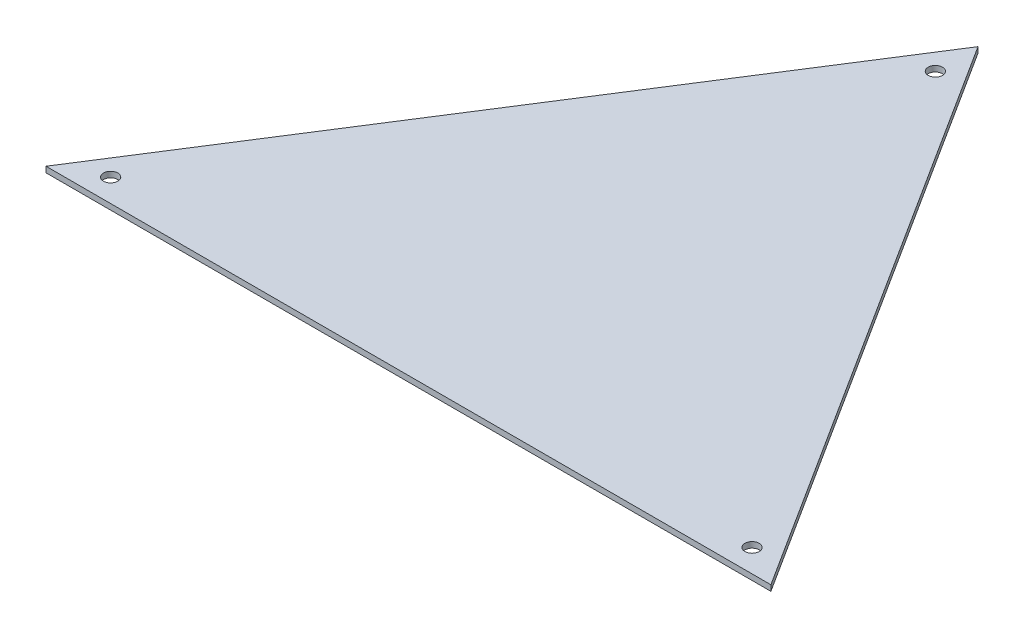
ISO-10303-21;
HEADER;
FILE_DESCRIPTION(('STEP AP214'),'2;1');
FILE_NAME('part.step','',(''),(''),'','','');
FILE_SCHEMA(('AUTOMOTIVE_DESIGN { 1 0 10303 214 1 1 1 1 }'));
ENDSEC;
DATA;
#1=APPLICATION_CONTEXT('core data for automotive mechanical design processes');
#2=APPLICATION_PROTOCOL_DEFINITION('international standard','automotive_design',2000,#1);
#3=PRODUCT_CONTEXT('',#1,'mechanical');
#4=PRODUCT('Part','Part','',(#3));
#5=PRODUCT_RELATED_PRODUCT_CATEGORY('part','',(#4));
#6=PRODUCT_DEFINITION_FORMATION('','',#4);
#7=PRODUCT_DEFINITION_CONTEXT('part definition',#1,'design');
#8=PRODUCT_DEFINITION('design','',#6,#7);
#9=PRODUCT_DEFINITION_SHAPE('','',#8);
#10=(LENGTH_UNIT() NAMED_UNIT(*) SI_UNIT(.MILLI.,.METRE.));
#11=(NAMED_UNIT(*) PLANE_ANGLE_UNIT() SI_UNIT($,.RADIAN.));
#12=(NAMED_UNIT(*) SI_UNIT($,.STERADIAN.) SOLID_ANGLE_UNIT());
#13=UNCERTAINTY_MEASURE_WITH_UNIT(LENGTH_MEASURE(1.E-05),#10,'distance_accuracy_value','');
#14=(GEOMETRIC_REPRESENTATION_CONTEXT(3) GLOBAL_UNCERTAINTY_ASSIGNED_CONTEXT((#13)) GLOBAL_UNIT_ASSIGNED_CONTEXT((#10,
#11,#12)) REPRESENTATION_CONTEXT('',''));
#15=CARTESIAN_POINT('',(0.,0.,0.));
#16=DIRECTION('',(0.,0.,1.));
#17=DIRECTION('',(1.,0.,0.));
#18=AXIS2_PLACEMENT_3D('',#15,#16,#17);
#19=CARTESIAN_POINT('',(0.,1.5875,0.));
#20=DIRECTION('',(0.,1.,0.));
#21=DIRECTION('',(0.,0.,1.));
#22=AXIS2_PLACEMENT_3D('',#19,#20,#21);
#23=PLANE('',#22);
#24=CARTESIAN_POINT('',(0.,1.5875,-279.4));
#25=DIRECTION('',(0.,1.,0.));
#26=DIRECTION('',(0.,0.,1.));
#27=AXIS2_PLACEMENT_3D('',#24,#25,#26);
#28=CIRCLE('',#27,3.96875000000003);
#29=CARTESIAN_POINT('',(0.,1.5875,-275.43125));
#30=VERTEX_POINT('',#29);
#31=EDGE_CURVE('E116',#30,#30,#28,.T.);
#32=ORIENTED_EDGE('',*,*,#31,.F.);
#33=EDGE_LOOP('',(#32));
#34=FACE_BOUND('',#33,.T.);
#35=DIRECTION('',(-0.536875492193159,0.,-0.843661487732107));
#36=VECTOR('',#35,1.);
#37=CARTESIAN_POINT('',(200.935249190195,1.5875,12.7));
#38=LINE('',#37,#36);
#39=CARTESIAN_POINT('',(200.935249190195,1.5875,12.7));
#40=VERTEX_POINT('',#39);
#41=CARTESIAN_POINT('',(0.,1.5875,-303.055391584592));
#42=VERTEX_POINT('',#41);
#43=EDGE_CURVE('E76',#40,#42,#38,.T.);
#44=ORIENTED_EDGE('',*,*,#43,.T.);
#45=DIRECTION('',(-0.536875492193159,0.,0.843661487732108));
#46=VECTOR('',#45,1.);
#47=CARTESIAN_POINT('',(0.,1.5875,-303.055391584592));
#48=LINE('',#47,#46);
#49=CARTESIAN_POINT('',(-200.935249190195,1.5875,12.7));
#50=VERTEX_POINT('',#49);
#51=EDGE_CURVE('E72',#42,#50,#48,.T.);
#52=ORIENTED_EDGE('',*,*,#51,.T.);
#53=DIRECTION('',(1.,0.,0.));
#54=VECTOR('',#53,1.);
#55=CARTESIAN_POINT('',(-200.935249190195,1.5875,12.7));
#56=LINE('',#55,#54);
#57=EDGE_CURVE('E52',#50,#40,#56,.T.);
#58=ORIENTED_EDGE('',*,*,#57,.T.);
#59=EDGE_LOOP('',(#44,#52,#58));
#60=FACE_BOUND('',#59,.T.);
#61=CARTESIAN_POINT('',(-177.8,1.5875,0.));
#62=DIRECTION('',(0.,1.,0.));
#63=DIRECTION('',(0.,0.,1.));
#64=AXIS2_PLACEMENT_3D('',#61,#62,#63);
#65=CIRCLE('',#64,3.96874999999999);
#66=CARTESIAN_POINT('',(-177.8,1.5875,3.96874999999999));
#67=VERTEX_POINT('',#66);
#68=EDGE_CURVE('E86',#67,#67,#65,.T.);
#69=ORIENTED_EDGE('',*,*,#68,.F.);
#70=EDGE_LOOP('',(#69));
#71=FACE_BOUND('',#70,.T.);
#72=CARTESIAN_POINT('',(177.8,1.5875,0.));
#73=DIRECTION('',(0.,1.,0.));
#74=DIRECTION('',(0.,0.,1.));
#75=AXIS2_PLACEMENT_3D('',#72,#73,#74);
#76=CIRCLE('',#75,3.96874999999999);
#77=CARTESIAN_POINT('',(177.8,1.5875,3.96874999999999));
#78=VERTEX_POINT('',#77);
#79=EDGE_CURVE('E111',#78,#78,#76,.T.);
#80=ORIENTED_EDGE('',*,*,#79,.F.);
#81=EDGE_LOOP('',(#80));
#82=FACE_BOUND('',#81,.T.);
#83=ADVANCED_FACE('F35',(#34,#60,#71,#82),#23,.T.);
#84=CARTESIAN_POINT('',(0.,-1.5875,0.));
#85=DIRECTION('',(0.,1.,0.));
#86=DIRECTION('',(0.,0.,1.));
#87=AXIS2_PLACEMENT_3D('',#84,#85,#86);
#88=PLANE('',#87);
#89=DIRECTION('',(-0.536875492193159,0.,-0.843661487732107));
#90=VECTOR('',#89,1.);
#91=CARTESIAN_POINT('',(200.935249190195,-1.5875,12.7));
#92=LINE('',#91,#90);
#93=CARTESIAN_POINT('',(200.935249190195,-1.5875,12.7));
#94=VERTEX_POINT('',#93);
#95=CARTESIAN_POINT('',(0.,-1.5875,-303.055391584592));
#96=VERTEX_POINT('',#95);
#97=EDGE_CURVE('E83',#94,#96,#92,.T.);
#98=ORIENTED_EDGE('',*,*,#97,.F.);
#99=DIRECTION('',(1.,0.,0.));
#100=VECTOR('',#99,1.);
#101=CARTESIAN_POINT('',(-200.935249190195,-1.5875,12.7));
#102=LINE('',#101,#100);
#103=CARTESIAN_POINT('',(-200.935249190195,-1.5875,12.7));
#104=VERTEX_POINT('',#103);
#105=EDGE_CURVE('E69',#104,#94,#102,.T.);
#106=ORIENTED_EDGE('',*,*,#105,.F.);
#107=DIRECTION('',(-0.536875492193159,0.,0.843661487732108));
#108=VECTOR('',#107,1.);
#109=CARTESIAN_POINT('',(0.,-1.5875,-303.055391584592));
#110=LINE('',#109,#108);
#111=EDGE_CURVE('E64',#96,#104,#110,.T.);
#112=ORIENTED_EDGE('',*,*,#111,.F.);
#113=EDGE_LOOP('',(#98,#106,#112));
#114=FACE_BOUND('',#113,.T.);
#115=CARTESIAN_POINT('',(-177.8,-1.5875,0.));
#116=DIRECTION('',(0.,1.,0.));
#117=DIRECTION('',(0.,0.,1.));
#118=AXIS2_PLACEMENT_3D('',#115,#116,#117);
#119=CIRCLE('',#118,3.96874999999999);
#120=CARTESIAN_POINT('',(-177.8,-1.5875,3.96874999999999));
#121=VERTEX_POINT('',#120);
#122=EDGE_CURVE('E90',#121,#121,#119,.T.);
#123=ORIENTED_EDGE('',*,*,#122,.T.);
#124=EDGE_LOOP('',(#123));
#125=FACE_BOUND('',#124,.T.);
#126=CARTESIAN_POINT('',(0.,-1.5875,-279.4));
#127=DIRECTION('',(0.,1.,0.));
#128=DIRECTION('',(0.,0.,1.));
#129=AXIS2_PLACEMENT_3D('',#126,#127,#128);
#130=CIRCLE('',#129,3.96875000000003);
#131=CARTESIAN_POINT('',(0.,-1.5875,-275.43125));
#132=VERTEX_POINT('',#131);
#133=EDGE_CURVE('E106',#132,#132,#130,.T.);
#134=ORIENTED_EDGE('',*,*,#133,.T.);
#135=EDGE_LOOP('',(#134));
#136=FACE_BOUND('',#135,.T.);
#137=CARTESIAN_POINT('',(177.8,-1.5875,0.));
#138=DIRECTION('',(0.,1.,0.));
#139=DIRECTION('',(0.,0.,1.));
#140=AXIS2_PLACEMENT_3D('',#137,#138,#139);
#141=CIRCLE('',#140,3.96874999999999);
#142=CARTESIAN_POINT('',(177.8,-1.5875,3.96874999999999));
#143=VERTEX_POINT('',#142);
#144=EDGE_CURVE('E109',#143,#143,#141,.T.);
#145=ORIENTED_EDGE('',*,*,#144,.T.);
#146=EDGE_LOOP('',(#145));
#147=FACE_BOUND('',#146,.T.);
#148=ADVANCED_FACE('F96',(#114,#125,#136,#147),#88,.F.);
#149=CARTESIAN_POINT('',(200.935249190195,1.5875,12.7));
#150=DIRECTION('',(-0.843661487732107,0.,0.536875492193159));
#151=DIRECTION('',(0.536875492193159,0.,0.843661487732107));
#152=AXIS2_PLACEMENT_3D('',#149,#150,#151);
#153=PLANE('',#152);
#154=ORIENTED_EDGE('',*,*,#97,.T.);
#155=DIRECTION('',(0.,-1.,0.));
#156=VECTOR('',#155,1.);
#157=CARTESIAN_POINT('',(0.,1.5875,-303.055391584592));
#158=LINE('',#157,#156);
#159=EDGE_CURVE('E11',#42,#96,#158,.T.);
#160=ORIENTED_EDGE('',*,*,#159,.F.);
#161=ORIENTED_EDGE('',*,*,#43,.F.);
#162=DIRECTION('',(0.,-1.,0.));
#163=VECTOR('',#162,1.);
#164=CARTESIAN_POINT('',(200.935249190195,1.5875,12.7));
#165=LINE('',#164,#163);
#166=EDGE_CURVE('E84',#40,#94,#165,.T.);
#167=ORIENTED_EDGE('',*,*,#166,.T.);
#168=EDGE_LOOP('',(#154,#160,#161,#167));
#169=FACE_BOUND('',#168,.T.);
#170=ADVANCED_FACE('F37',(#169),#153,.F.);
#171=CARTESIAN_POINT('',(0.,1.5875,-303.055391584592));
#172=DIRECTION('',(0.843661487732107,0.,0.536875492193159));
#173=DIRECTION('',(0.536875492193159,0.,-0.843661487732108));
#174=AXIS2_PLACEMENT_3D('',#171,#172,#173);
#175=PLANE('',#174);
#176=ORIENTED_EDGE('',*,*,#111,.T.);
#177=DIRECTION('',(0.,-1.,0.));
#178=VECTOR('',#177,1.);
#179=CARTESIAN_POINT('',(-200.935249190195,1.5875,12.7));
#180=LINE('',#179,#178);
#181=EDGE_CURVE('E44',#50,#104,#180,.T.);
#182=ORIENTED_EDGE('',*,*,#181,.F.);
#183=ORIENTED_EDGE('',*,*,#51,.F.);
#184=ORIENTED_EDGE('',*,*,#159,.T.);
#185=EDGE_LOOP('',(#176,#182,#183,#184));
#186=FACE_BOUND('',#185,.T.);
#187=ADVANCED_FACE('F73',(#186),#175,.F.);
#188=CARTESIAN_POINT('',(-200.935249190195,1.5875,12.7));
#189=DIRECTION('',(0.,0.,-1.));
#190=DIRECTION('',(-1.,0.,0.));
#191=AXIS2_PLACEMENT_3D('',#188,#189,#190);
#192=PLANE('',#191);
#193=ORIENTED_EDGE('',*,*,#105,.T.);
#194=ORIENTED_EDGE('',*,*,#166,.F.);
#195=ORIENTED_EDGE('',*,*,#57,.F.);
#196=ORIENTED_EDGE('',*,*,#181,.T.);
#197=EDGE_LOOP('',(#193,#194,#195,#196));
#198=FACE_BOUND('',#197,.T.);
#199=ADVANCED_FACE('F95',(#198),#192,.F.);
#200=CARTESIAN_POINT('',(-177.8,1.5875,0.));
#201=DIRECTION('',(0.,-1.,0.));
#202=DIRECTION('',(0.,0.,-1.));
#203=AXIS2_PLACEMENT_3D('',#200,#201,#202);
#204=CYLINDRICAL_SURFACE('',#203,3.96874999999999);
#205=ORIENTED_EDGE('',*,*,#68,.T.);
#206=EDGE_LOOP('',(#205));
#207=FACE_BOUND('',#206,.T.);
#208=ORIENTED_EDGE('',*,*,#122,.F.);
#209=EDGE_LOOP('',(#208));
#210=FACE_BOUND('',#209,.T.);
#211=ADVANCED_FACE('F130',(#207,#210),#204,.F.);
#212=CARTESIAN_POINT('',(0.,1.5875,-279.4));
#213=DIRECTION('',(0.,-1.,0.));
#214=DIRECTION('',(0.,0.,-1.));
#215=AXIS2_PLACEMENT_3D('',#212,#213,#214);
#216=CYLINDRICAL_SURFACE('',#215,3.96875000000003);
#217=ORIENTED_EDGE('',*,*,#31,.T.);
#218=EDGE_LOOP('',(#217));
#219=FACE_BOUND('',#218,.T.);
#220=ORIENTED_EDGE('',*,*,#133,.F.);
#221=EDGE_LOOP('',(#220));
#222=FACE_BOUND('',#221,.T.);
#223=ADVANCED_FACE('F122',(#219,#222),#216,.F.);
#224=CARTESIAN_POINT('',(177.8,1.5875,0.));
#225=DIRECTION('',(0.,-1.,0.));
#226=DIRECTION('',(0.,0.,-1.));
#227=AXIS2_PLACEMENT_3D('',#224,#225,#226);
#228=CYLINDRICAL_SURFACE('',#227,3.96874999999999);
#229=ORIENTED_EDGE('',*,*,#79,.T.);
#230=EDGE_LOOP('',(#229));
#231=FACE_BOUND('',#230,.T.);
#232=ORIENTED_EDGE('',*,*,#144,.F.);
#233=EDGE_LOOP('',(#232));
#234=FACE_BOUND('',#233,.T.);
#235=ADVANCED_FACE('F176',(#231,#234),#228,.F.);
#236=CLOSED_SHELL('',(#83,#148,#170,#187,#199,#211,#223,#235));
#237=MANIFOLD_SOLID_BREP('B2',#236);
#238=ADVANCED_BREP_SHAPE_REPRESENTATION('',(#18,#237),#14);
#239=SHAPE_DEFINITION_REPRESENTATION(#9,#238);
ENDSEC;
END-ISO-10303-21;
